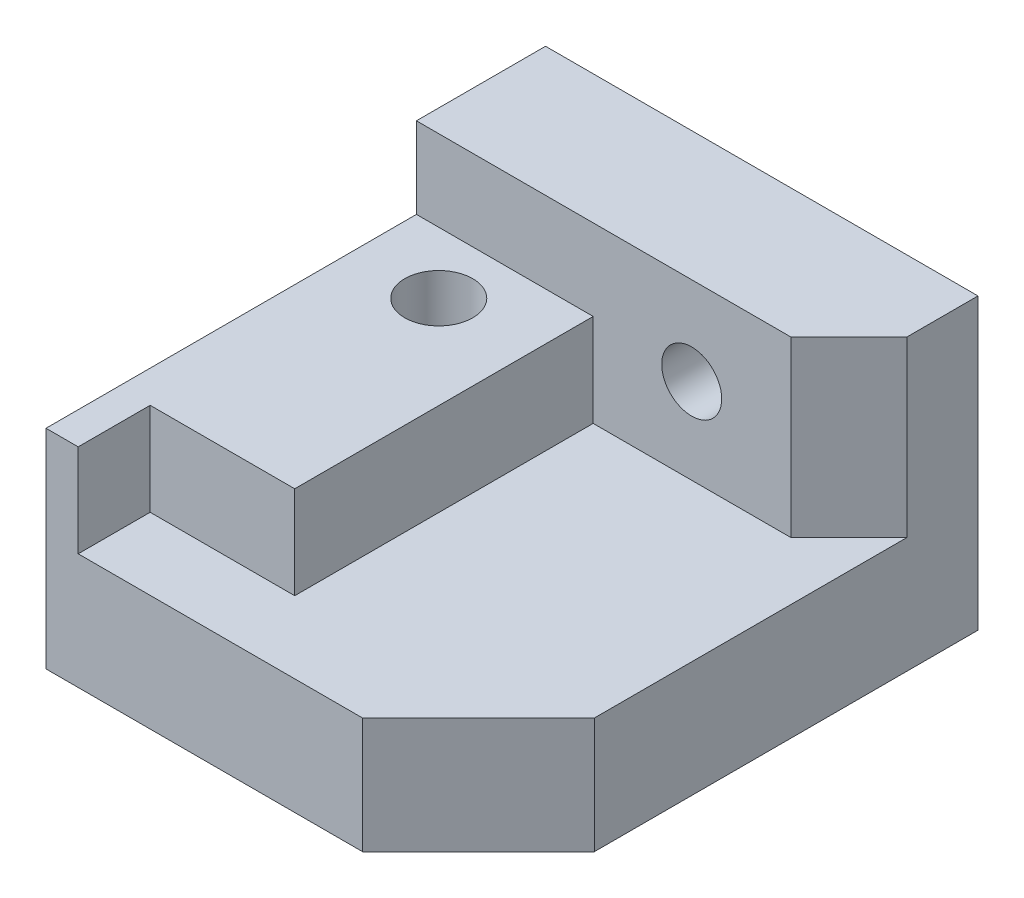
ISO-10303-21;
HEADER;
FILE_DESCRIPTION(('STEP AP214'),'2;1');
FILE_NAME('part.step','',(''),(''),'','','');
FILE_SCHEMA(('AUTOMOTIVE_DESIGN { 1 0 10303 214 1 1 1 1 }'));
ENDSEC;
DATA;
#1=APPLICATION_CONTEXT('core data for automotive mechanical design processes');
#2=APPLICATION_PROTOCOL_DEFINITION('international standard','automotive_design',2000,#1);
#3=PRODUCT_CONTEXT('',#1,'mechanical');
#4=PRODUCT('Part','Part','',(#3));
#5=PRODUCT_RELATED_PRODUCT_CATEGORY('part','',(#4));
#6=PRODUCT_DEFINITION_FORMATION('','',#4);
#7=PRODUCT_DEFINITION_CONTEXT('part definition',#1,'design');
#8=PRODUCT_DEFINITION('design','',#6,#7);
#9=PRODUCT_DEFINITION_SHAPE('','',#8);
#10=(LENGTH_UNIT() NAMED_UNIT(*) SI_UNIT(.MILLI.,.METRE.));
#11=(NAMED_UNIT(*) PLANE_ANGLE_UNIT() SI_UNIT($,.RADIAN.));
#12=(NAMED_UNIT(*) SI_UNIT($,.STERADIAN.) SOLID_ANGLE_UNIT());
#13=UNCERTAINTY_MEASURE_WITH_UNIT(LENGTH_MEASURE(1.E-05),#10,'distance_accuracy_value','');
#14=(GEOMETRIC_REPRESENTATION_CONTEXT(3) GLOBAL_UNCERTAINTY_ASSIGNED_CONTEXT((#13)) GLOBAL_UNIT_ASSIGNED_CONTEXT((#10,
#11,#12)) REPRESENTATION_CONTEXT('',''));
#15=CARTESIAN_POINT('',(0.,0.,0.));
#16=DIRECTION('',(0.,0.,1.));
#17=DIRECTION('',(1.,0.,0.));
#18=AXIS2_PLACEMENT_3D('',#15,#16,#17);
#19=CARTESIAN_POINT('',(0.,10.,0.));
#20=DIRECTION('',(0.,1.,0.));
#21=DIRECTION('',(0.,0.,1.));
#22=AXIS2_PLACEMENT_3D('',#19,#20,#21);
#23=PLANE('',#22);
#24=DIRECTION('',(-0.707106781186548,0.,0.707106781186548));
#25=VECTOR('',#24,1.);
#26=CARTESIAN_POINT('',(0.178897186023816,10.,0.178897186023816));
#27=LINE('',#26,#25);
#28=CARTESIAN_POINT('',(37.3462177965765,10.,-36.9884234245288));
#29=VERTEX_POINT('',#28);
#30=CARTESIAN_POINT('',(32.3462177965765,10.,-31.9884234245289));
#31=VERTEX_POINT('',#30);
#32=EDGE_CURVE('E102',#29,#31,#27,.T.);
#33=ORIENTED_EDGE('',*,*,#32,.T.);
#34=DIRECTION('',(-1.,0.,0.));
#35=VECTOR('',#34,1.);
#36=CARTESIAN_POINT('',(0.,10.,-31.9884234245289));
#37=LINE('',#36,#35);
#38=CARTESIAN_POINT('',(15.2645951036508,10.,-31.9884234245289));
#39=VERTEX_POINT('',#38);
#40=EDGE_CURVE('E190',#31,#39,#37,.T.);
#41=ORIENTED_EDGE('',*,*,#40,.T.);
#42=DIRECTION('',(0.,0.,1.));
#43=VECTOR('',#42,1.);
#44=CARTESIAN_POINT('',(15.2645951036508,10.,-32.0144950211485));
#45=LINE('',#44,#43);
#46=CARTESIAN_POINT('',(15.2645951036508,10.,-6.21379025277576));
#47=VERTEX_POINT('',#46);
#48=EDGE_CURVE('E185',#39,#47,#45,.T.);
#49=ORIENTED_EDGE('',*,*,#48,.T.);
#50=DIRECTION('',(-1.,0.,0.));
#51=VECTOR('',#50,1.);
#52=CARTESIAN_POINT('',(15.2645951036508,10.,-6.21379025277576));
#53=LINE('',#52,#51);
#54=CARTESIAN_POINT('',(2.78057267490278,10.,-6.21379025277576));
#55=VERTEX_POINT('',#54);
#56=EDGE_CURVE('E169',#47,#55,#53,.T.);
#57=ORIENTED_EDGE('',*,*,#56,.T.);
#58=DIRECTION('',(0.,0.,1.));
#59=VECTOR('',#58,1.);
#60=CARTESIAN_POINT('',(2.78057267490278,10.,0.));
#61=LINE('',#60,#59);
#62=CARTESIAN_POINT('',(2.78057267490278,10.,0.));
#63=VERTEX_POINT('',#62);
#64=EDGE_CURVE('E179',#55,#63,#61,.T.);
#65=ORIENTED_EDGE('',*,*,#64,.T.);
#66=DIRECTION('',(1.,0.,0.));
#67=VECTOR('',#66,1.);
#68=CARTESIAN_POINT('',(0.,10.,0.));
#69=LINE('',#68,#67);
#70=CARTESIAN_POINT('',(27.3462177965765,10.,0.));
#71=VERTEX_POINT('',#70);
#72=EDGE_CURVE('E94',#63,#71,#69,.T.);
#73=ORIENTED_EDGE('',*,*,#72,.T.);
#74=DIRECTION('',(0.707106781186548,0.,-0.707106781186547));
#75=VECTOR('',#74,1.);
#76=CARTESIAN_POINT('',(27.3462177965765,10.,0.));
#77=LINE('',#76,#75);
#78=CARTESIAN_POINT('',(37.3462177965765,10.,-10.));
#79=VERTEX_POINT('',#78);
#80=EDGE_CURVE('E211',#71,#79,#77,.T.);
#81=ORIENTED_EDGE('',*,*,#80,.T.);
#82=DIRECTION('',(0.,0.,-1.));
#83=VECTOR('',#82,1.);
#84=CARTESIAN_POINT('',(37.3462177965765,10.,-10.));
#85=LINE('',#84,#83);
#86=EDGE_CURVE('E215',#79,#29,#85,.T.);
#87=ORIENTED_EDGE('',*,*,#86,.T.);
#88=EDGE_LOOP('',(#33,#41,#49,#57,#65,#73,#81,#87));
#89=FACE_BOUND('',#88,.T.);
#90=ADVANCED_FACE('F76',(#89),#23,.T.);
#91=CARTESIAN_POINT('',(0.,18.,0.));
#92=DIRECTION('',(0.,1.,0.));
#93=DIRECTION('',(0.,0.,1.));
#94=AXIS2_PLACEMENT_3D('',#91,#92,#93);
#95=PLANE('',#94);
#96=CARTESIAN_POINT('',(7.23477267971787,18.,-26.6815035731092));
#97=DIRECTION('',(0.,1.,0.));
#98=DIRECTION('',(0.,0.,1.));
#99=AXIS2_PLACEMENT_3D('',#96,#97,#98);
#100=CIRCLE('',#99,2.93404528514396);
#101=CARTESIAN_POINT('',(7.23477267971787,18.,-23.7474582879652));
#102=VERTEX_POINT('',#101);
#103=EDGE_CURVE('E483',#102,#102,#100,.T.);
#104=ORIENTED_EDGE('',*,*,#103,.F.);
#105=EDGE_LOOP('',(#104));
#106=FACE_BOUND('',#105,.T.);
#107=DIRECTION('',(0.,0.,1.));
#108=VECTOR('',#107,1.);
#109=CARTESIAN_POINT('',(2.78057267490278,18.,0.));
#110=LINE('',#109,#108);
#111=CARTESIAN_POINT('',(2.78057267490278,18.,-6.21379025277576));
#112=VERTEX_POINT('',#111);
#113=CARTESIAN_POINT('',(2.78057267490278,18.,0.));
#114=VERTEX_POINT('',#113);
#115=EDGE_CURVE('E180',#112,#114,#110,.T.);
#116=ORIENTED_EDGE('',*,*,#115,.F.);
#117=DIRECTION('',(-1.,0.,0.));
#118=VECTOR('',#117,1.);
#119=CARTESIAN_POINT('',(15.2645951036508,18.,-6.21379025277576));
#120=LINE('',#119,#118);
#121=CARTESIAN_POINT('',(15.2645951036508,18.,-6.21379025277576));
#122=VERTEX_POINT('',#121);
#123=EDGE_CURVE('E490',#122,#112,#120,.T.);
#124=ORIENTED_EDGE('',*,*,#123,.F.);
#125=DIRECTION('',(0.,0.,1.));
#126=VECTOR('',#125,1.);
#127=CARTESIAN_POINT('',(15.2645951036508,18.,-32.0144950211485));
#128=LINE('',#127,#126);
#129=CARTESIAN_POINT('',(15.2645951036508,18.,-31.9884234245289));
#130=VERTEX_POINT('',#129);
#131=EDGE_CURVE('E187',#130,#122,#128,.T.);
#132=ORIENTED_EDGE('',*,*,#131,.F.);
#133=DIRECTION('',(-1.,0.,0.));
#134=VECTOR('',#133,1.);
#135=CARTESIAN_POINT('',(0.,18.,-31.9884234245289));
#136=LINE('',#135,#134);
#137=CARTESIAN_POINT('',(0.,18.,-31.9884234245289));
#138=VERTEX_POINT('',#137);
#139=EDGE_CURVE('E532',#130,#138,#136,.T.);
#140=ORIENTED_EDGE('',*,*,#139,.T.);
#141=DIRECTION('',(0.,0.,1.));
#142=VECTOR('',#141,1.);
#143=CARTESIAN_POINT('',(0.,18.,-32.0144950211485));
#144=LINE('',#143,#142);
#145=CARTESIAN_POINT('',(0.,18.,0.));
#146=VERTEX_POINT('',#145);
#147=EDGE_CURVE('E80',#138,#146,#144,.T.);
#148=ORIENTED_EDGE('',*,*,#147,.T.);
#149=DIRECTION('',(1.,0.,0.));
#150=VECTOR('',#149,1.);
#151=CARTESIAN_POINT('',(0.,18.,0.));
#152=LINE('',#151,#150);
#153=EDGE_CURVE('E192',#146,#114,#152,.T.);
#154=ORIENTED_EDGE('',*,*,#153,.T.);
#155=EDGE_LOOP('',(#116,#124,#132,#140,#148,#154));
#156=FACE_BOUND('',#155,.T.);
#157=ADVANCED_FACE('F291',(#106,#156),#95,.T.);
#158=CARTESIAN_POINT('',(15.2645951036508,10.,-32.0144950211485));
#159=DIRECTION('',(-1.,0.,0.));
#160=DIRECTION('',(0.,0.,1.));
#161=AXIS2_PLACEMENT_3D('',#158,#159,#160);
#162=PLANE('',#161);
#163=ORIENTED_EDGE('',*,*,#131,.T.);
#164=DIRECTION('',(0.,1.,0.));
#165=VECTOR('',#164,1.);
#166=CARTESIAN_POINT('',(15.2645951036508,10.,-6.21379025277576));
#167=LINE('',#166,#165);
#168=EDGE_CURVE('E173',#47,#122,#167,.T.);
#169=ORIENTED_EDGE('',*,*,#168,.F.);
#170=ORIENTED_EDGE('',*,*,#48,.F.);
#171=DIRECTION('',(0.,-1.,0.));
#172=VECTOR('',#171,1.);
#173=CARTESIAN_POINT('',(15.2645951036508,10.,-31.9884234245289));
#174=LINE('',#173,#172);
#175=EDGE_CURVE('E12',#130,#39,#174,.T.);
#176=ORIENTED_EDGE('',*,*,#175,.F.);
#177=EDGE_LOOP('',(#163,#169,#170,#176));
#178=FACE_BOUND('',#177,.T.);
#179=ADVANCED_FACE('F184',(#178),#162,.F.);
#180=CARTESIAN_POINT('',(27.3462177965765,10.,0.));
#181=DIRECTION('',(-0.707106781186547,0.,-0.707106781186548));
#182=DIRECTION('',(-0.707106781186548,0.,0.707106781186547));
#183=AXIS2_PLACEMENT_3D('',#180,#181,#182);
#184=PLANE('',#183);
#185=DIRECTION('',(0.707106781186548,0.,-0.707106781186547));
#186=VECTOR('',#185,1.);
#187=CARTESIAN_POINT('',(27.3462177965765,0.,0.));
#188=LINE('',#187,#186);
#189=CARTESIAN_POINT('',(27.3462177965765,0.,0.));
#190=VERTEX_POINT('',#189);
#191=CARTESIAN_POINT('',(37.3462177965765,0.,-10.));
#192=VERTEX_POINT('',#191);
#193=EDGE_CURVE('E197',#190,#192,#188,.T.);
#194=ORIENTED_EDGE('',*,*,#193,.T.);
#195=DIRECTION('',(0.,-1.,0.));
#196=VECTOR('',#195,1.);
#197=CARTESIAN_POINT('',(37.3462177965765,10.,-10.));
#198=LINE('',#197,#196);
#199=EDGE_CURVE('E87',#79,#192,#198,.T.);
#200=ORIENTED_EDGE('',*,*,#199,.F.);
#201=ORIENTED_EDGE('',*,*,#80,.F.);
#202=DIRECTION('',(0.,-1.,0.));
#203=VECTOR('',#202,1.);
#204=CARTESIAN_POINT('',(27.3462177965765,10.,0.));
#205=LINE('',#204,#203);
#206=EDGE_CURVE('E226',#71,#190,#205,.T.);
#207=ORIENTED_EDGE('',*,*,#206,.T.);
#208=EDGE_LOOP('',(#194,#200,#201,#207));
#209=FACE_BOUND('',#208,.T.);
#210=ADVANCED_FACE('F78',(#209),#184,.F.);
#211=CARTESIAN_POINT('',(37.3462177965765,10.,-10.));
#212=DIRECTION('',(-1.,0.,0.));
#213=DIRECTION('',(0.,0.,1.));
#214=AXIS2_PLACEMENT_3D('',#211,#212,#213);
#215=PLANE('',#214);
#216=DIRECTION('',(0.,-1.,0.));
#217=VECTOR('',#216,1.);
#218=CARTESIAN_POINT('',(37.3462177965765,10.,-43.1388364195815));
#219=LINE('',#218,#217);
#220=CARTESIAN_POINT('',(37.3462177965765,25.,-43.1388364195815));
#221=VERTEX_POINT('',#220);
#222=CARTESIAN_POINT('',(37.3462177965765,0.,-43.1388364195815));
#223=VERTEX_POINT('',#222);
#224=EDGE_CURVE('E238',#221,#223,#219,.T.);
#225=ORIENTED_EDGE('',*,*,#224,.F.);
#226=DIRECTION('',(0.,0.,1.));
#227=VECTOR('',#226,1.);
#228=CARTESIAN_POINT('',(37.3462177965765,25.,-43.1388364195815));
#229=LINE('',#228,#227);
#230=CARTESIAN_POINT('',(37.3462177965765,25.,-36.9884234245288));
#231=VERTEX_POINT('',#230);
#232=EDGE_CURVE('E512',#221,#231,#229,.T.);
#233=ORIENTED_EDGE('',*,*,#232,.T.);
#234=DIRECTION('',(0.,-1.,0.));
#235=VECTOR('',#234,1.);
#236=CARTESIAN_POINT('',(37.3462177965765,25.,-36.9884234245288));
#237=LINE('',#236,#235);
#238=EDGE_CURVE('E525',#231,#29,#237,.T.);
#239=ORIENTED_EDGE('',*,*,#238,.T.);
#240=ORIENTED_EDGE('',*,*,#86,.F.);
#241=ORIENTED_EDGE('',*,*,#199,.T.);
#242=DIRECTION('',(0.,0.,-1.));
#243=VECTOR('',#242,1.);
#244=CARTESIAN_POINT('',(37.3462177965765,0.,-10.));
#245=LINE('',#244,#243);
#246=EDGE_CURVE('E259',#192,#223,#245,.T.);
#247=ORIENTED_EDGE('',*,*,#246,.T.);
#248=EDGE_LOOP('',(#225,#233,#239,#240,#241,#247));
#249=FACE_BOUND('',#248,.T.);
#250=ADVANCED_FACE('F258',(#249),#215,.F.);
#251=CARTESIAN_POINT('',(0.,10.,-43.1388364195815));
#252=DIRECTION('',(0.,0.,-1.));
#253=DIRECTION('',(-1.,0.,0.));
#254=AXIS2_PLACEMENT_3D('',#251,#252,#253);
#255=PLANE('',#254);
#256=CARTESIAN_POINT('',(23.7733258062192,17.3847516461843,-43.1388364195815));
#257=DIRECTION('',(0.,0.,-1.));
#258=DIRECTION('',(-1.,0.,0.));
#259=AXIS2_PLACEMENT_3D('',#256,#257,#258);
#260=CIRCLE('',#259,2.59003935259056);
#261=CARTESIAN_POINT('',(21.1832864536287,17.3847516461843,-43.1388364195815));
#262=VERTEX_POINT('',#261);
#263=EDGE_CURVE('E476',#262,#262,#260,.T.);
#264=ORIENTED_EDGE('',*,*,#263,.F.);
#265=EDGE_LOOP('',(#264));
#266=FACE_BOUND('',#265,.T.);
#267=DIRECTION('',(1.,0.,0.));
#268=VECTOR('',#267,1.);
#269=CARTESIAN_POINT('',(0.,0.,-43.1388364195815));
#270=LINE('',#269,#268);
#271=CARTESIAN_POINT('',(0.,0.,-43.1388364195815));
#272=VERTEX_POINT('',#271);
#273=EDGE_CURVE('E264',#272,#223,#270,.T.);
#274=ORIENTED_EDGE('',*,*,#273,.F.);
#275=DIRECTION('',(0.,-1.,0.));
#276=VECTOR('',#275,1.);
#277=CARTESIAN_POINT('',(0.,10.,-43.1388364195815));
#278=LINE('',#277,#276);
#279=CARTESIAN_POINT('',(0.,25.,-43.1388364195815));
#280=VERTEX_POINT('',#279);
#281=EDGE_CURVE('E230',#280,#272,#278,.T.);
#282=ORIENTED_EDGE('',*,*,#281,.F.);
#283=DIRECTION('',(1.,0.,0.));
#284=VECTOR('',#283,1.);
#285=CARTESIAN_POINT('',(0.,25.,-43.1388364195815));
#286=LINE('',#285,#284);
#287=EDGE_CURVE('E516',#280,#221,#286,.T.);
#288=ORIENTED_EDGE('',*,*,#287,.T.);
#289=ORIENTED_EDGE('',*,*,#224,.T.);
#290=EDGE_LOOP('',(#274,#282,#288,#289));
#291=FACE_BOUND('',#290,.T.);
#292=ADVANCED_FACE('F280',(#266,#291),#255,.T.);
#293=CARTESIAN_POINT('',(0.,10.,0.));
#294=DIRECTION('',(-1.,0.,0.));
#295=DIRECTION('',(0.,0.,1.));
#296=AXIS2_PLACEMENT_3D('',#293,#294,#295);
#297=PLANE('',#296);
#298=DIRECTION('',(0.,0.,1.));
#299=VECTOR('',#298,1.);
#300=CARTESIAN_POINT('',(0.,25.,-43.1388364195815));
#301=LINE('',#300,#299);
#302=CARTESIAN_POINT('',(0.,25.,-31.9884234245289));
#303=VERTEX_POINT('',#302);
#304=EDGE_CURVE('E278',#280,#303,#301,.T.);
#305=ORIENTED_EDGE('',*,*,#304,.F.);
#306=ORIENTED_EDGE('',*,*,#281,.T.);
#307=DIRECTION('',(0.,0.,-1.));
#308=VECTOR('',#307,1.);
#309=CARTESIAN_POINT('',(0.,0.,0.));
#310=LINE('',#309,#308);
#311=CARTESIAN_POINT('',(0.,0.,0.));
#312=VERTEX_POINT('',#311);
#313=EDGE_CURVE('E266',#312,#272,#310,.T.);
#314=ORIENTED_EDGE('',*,*,#313,.F.);
#315=DIRECTION('',(0.,-1.,0.));
#316=VECTOR('',#315,1.);
#317=CARTESIAN_POINT('',(0.,10.,0.));
#318=LINE('',#317,#316);
#319=EDGE_CURVE('E228',#146,#312,#318,.T.);
#320=ORIENTED_EDGE('',*,*,#319,.F.);
#321=ORIENTED_EDGE('',*,*,#147,.F.);
#322=DIRECTION('',(0.,-1.,0.));
#323=VECTOR('',#322,1.);
#324=CARTESIAN_POINT('',(0.,25.,-31.9884234245289));
#325=LINE('',#324,#323);
#326=EDGE_CURVE('E521',#303,#138,#325,.T.);
#327=ORIENTED_EDGE('',*,*,#326,.F.);
#328=EDGE_LOOP('',(#305,#306,#314,#320,#321,#327));
#329=FACE_BOUND('',#328,.T.);
#330=ADVANCED_FACE('F275',(#329),#297,.T.);
#331=CARTESIAN_POINT('',(0.,10.,0.));
#332=DIRECTION('',(0.,0.,-1.));
#333=DIRECTION('',(-1.,0.,0.));
#334=AXIS2_PLACEMENT_3D('',#331,#332,#333);
#335=PLANE('',#334);
#336=ORIENTED_EDGE('',*,*,#72,.F.);
#337=DIRECTION('',(0.,1.,0.));
#338=VECTOR('',#337,1.);
#339=CARTESIAN_POINT('',(2.78057267490278,10.,0.));
#340=LINE('',#339,#338);
#341=EDGE_CURVE('E500',#63,#114,#340,.T.);
#342=ORIENTED_EDGE('',*,*,#341,.T.);
#343=ORIENTED_EDGE('',*,*,#153,.F.);
#344=ORIENTED_EDGE('',*,*,#319,.T.);
#345=DIRECTION('',(1.,0.,0.));
#346=VECTOR('',#345,1.);
#347=CARTESIAN_POINT('',(0.,0.,0.));
#348=LINE('',#347,#346);
#349=EDGE_CURVE('E216',#312,#190,#348,.T.);
#350=ORIENTED_EDGE('',*,*,#349,.T.);
#351=ORIENTED_EDGE('',*,*,#206,.F.);
#352=EDGE_LOOP('',(#336,#342,#343,#344,#350,#351));
#353=FACE_BOUND('',#352,.T.);
#354=ADVANCED_FACE('F271',(#353),#335,.F.);
#355=CARTESIAN_POINT('',(0.,0.,0.));
#356=DIRECTION('',(0.,1.,0.));
#357=DIRECTION('',(0.,0.,1.));
#358=AXIS2_PLACEMENT_3D('',#355,#356,#357);
#359=PLANE('',#358);
#360=CARTESIAN_POINT('',(7.23477267971787,0.,-26.6815035731092));
#361=DIRECTION('',(0.,1.,0.));
#362=DIRECTION('',(0.,0.,1.));
#363=AXIS2_PLACEMENT_3D('',#360,#361,#362);
#364=CIRCLE('',#363,2.93404528514396);
#365=CARTESIAN_POINT('',(7.23477267971787,0.,-23.7474582879652));
#366=VERTEX_POINT('',#365);
#367=EDGE_CURVE('E486',#366,#366,#364,.T.);
#368=ORIENTED_EDGE('',*,*,#367,.T.);
#369=EDGE_LOOP('',(#368));
#370=FACE_BOUND('',#369,.T.);
#371=ORIENTED_EDGE('',*,*,#313,.T.);
#372=ORIENTED_EDGE('',*,*,#273,.T.);
#373=ORIENTED_EDGE('',*,*,#246,.F.);
#374=ORIENTED_EDGE('',*,*,#193,.F.);
#375=ORIENTED_EDGE('',*,*,#349,.F.);
#376=EDGE_LOOP('',(#371,#372,#373,#374,#375));
#377=FACE_BOUND('',#376,.T.);
#378=ADVANCED_FACE('F272',(#370,#377),#359,.F.);
#379=CARTESIAN_POINT('',(0.,25.,-31.9884234245289));
#380=DIRECTION('',(0.,0.,-1.));
#381=DIRECTION('',(-1.,0.,0.));
#382=AXIS2_PLACEMENT_3D('',#379,#380,#381);
#383=PLANE('',#382);
#384=CARTESIAN_POINT('',(23.7733258062192,17.3847516461843,-31.9884234245289));
#385=DIRECTION('',(0.,0.,1.));
#386=DIRECTION('',(1.,0.,0.));
#387=AXIS2_PLACEMENT_3D('',#384,#385,#386);
#388=CIRCLE('',#387,2.59003935259056);
#389=CARTESIAN_POINT('',(26.3633651588098,17.3847516461843,-31.9884234245289));
#390=VERTEX_POINT('',#389);
#391=EDGE_CURVE('E479',#390,#390,#388,.T.);
#392=ORIENTED_EDGE('',*,*,#391,.F.);
#393=EDGE_LOOP('',(#392));
#394=FACE_BOUND('',#393,.T.);
#395=ORIENTED_EDGE('',*,*,#40,.F.);
#396=DIRECTION('',(0.,-1.,0.));
#397=VECTOR('',#396,1.);
#398=CARTESIAN_POINT('',(32.3462177965765,25.,-31.9884234245289));
#399=LINE('',#398,#397);
#400=CARTESIAN_POINT('',(32.3462177965765,25.,-31.9884234245289));
#401=VERTEX_POINT('',#400);
#402=EDGE_CURVE('E528',#401,#31,#399,.T.);
#403=ORIENTED_EDGE('',*,*,#402,.F.);
#404=DIRECTION('',(1.,0.,0.));
#405=VECTOR('',#404,1.);
#406=CARTESIAN_POINT('',(0.,25.,-31.9884234245289));
#407=LINE('',#406,#405);
#408=EDGE_CURVE('E503',#303,#401,#407,.T.);
#409=ORIENTED_EDGE('',*,*,#408,.F.);
#410=ORIENTED_EDGE('',*,*,#326,.T.);
#411=ORIENTED_EDGE('',*,*,#139,.F.);
#412=ORIENTED_EDGE('',*,*,#175,.T.);
#413=EDGE_LOOP('',(#395,#403,#409,#410,#411,#412));
#414=FACE_BOUND('',#413,.T.);
#415=ADVANCED_FACE('F302',(#394,#414),#383,.F.);
#416=CARTESIAN_POINT('',(32.3462177965765,25.,-31.9884234245289));
#417=DIRECTION('',(-0.707106781186547,0.,-0.707106781186547));
#418=DIRECTION('',(-0.707106781186548,0.,0.707106781186548));
#419=AXIS2_PLACEMENT_3D('',#416,#417,#418);
#420=PLANE('',#419);
#421=ORIENTED_EDGE('',*,*,#32,.F.);
#422=ORIENTED_EDGE('',*,*,#238,.F.);
#423=DIRECTION('',(0.707106781186547,0.,-0.707106781186547));
#424=VECTOR('',#423,1.);
#425=CARTESIAN_POINT('',(32.3462177965765,25.,-31.9884234245289));
#426=LINE('',#425,#424);
#427=EDGE_CURVE('E509',#401,#231,#426,.T.);
#428=ORIENTED_EDGE('',*,*,#427,.F.);
#429=ORIENTED_EDGE('',*,*,#402,.T.);
#430=EDGE_LOOP('',(#421,#422,#428,#429));
#431=FACE_BOUND('',#430,.T.);
#432=ADVANCED_FACE('F323',(#431),#420,.F.);
#433=CARTESIAN_POINT('',(0.,25.,0.));
#434=DIRECTION('',(0.,-1.,0.));
#435=DIRECTION('',(0.,0.,-1.));
#436=AXIS2_PLACEMENT_3D('',#433,#434,#435);
#437=PLANE('',#436);
#438=ORIENTED_EDGE('',*,*,#408,.T.);
#439=ORIENTED_EDGE('',*,*,#427,.T.);
#440=ORIENTED_EDGE('',*,*,#232,.F.);
#441=ORIENTED_EDGE('',*,*,#287,.F.);
#442=ORIENTED_EDGE('',*,*,#304,.T.);
#443=EDGE_LOOP('',(#438,#439,#440,#441,#442));
#444=FACE_BOUND('',#443,.T.);
#445=ADVANCED_FACE('F332',(#444),#437,.F.);
#446=CARTESIAN_POINT('',(2.78057267490278,10.,0.));
#447=DIRECTION('',(-1.,0.,0.));
#448=DIRECTION('',(0.,0.,1.));
#449=AXIS2_PLACEMENT_3D('',#446,#447,#448);
#450=PLANE('',#449);
#451=ORIENTED_EDGE('',*,*,#115,.T.);
#452=ORIENTED_EDGE('',*,*,#341,.F.);
#453=ORIENTED_EDGE('',*,*,#64,.F.);
#454=DIRECTION('',(0.,1.,0.));
#455=VECTOR('',#454,1.);
#456=CARTESIAN_POINT('',(2.78057267490278,10.,-6.21379025277576));
#457=LINE('',#456,#455);
#458=EDGE_CURVE('E175',#55,#112,#457,.T.);
#459=ORIENTED_EDGE('',*,*,#458,.T.);
#460=EDGE_LOOP('',(#451,#452,#453,#459));
#461=FACE_BOUND('',#460,.T.);
#462=ADVANCED_FACE('F340',(#461),#450,.F.);
#463=CARTESIAN_POINT('',(15.2645951036508,10.,-6.21379025277576));
#464=DIRECTION('',(0.,0.,-1.));
#465=DIRECTION('',(-1.,0.,0.));
#466=AXIS2_PLACEMENT_3D('',#463,#464,#465);
#467=PLANE('',#466);
#468=ORIENTED_EDGE('',*,*,#123,.T.);
#469=ORIENTED_EDGE('',*,*,#458,.F.);
#470=ORIENTED_EDGE('',*,*,#56,.F.);
#471=ORIENTED_EDGE('',*,*,#168,.T.);
#472=EDGE_LOOP('',(#468,#469,#470,#471));
#473=FACE_BOUND('',#472,.T.);
#474=ADVANCED_FACE('F172',(#473),#467,.F.);
#475=CARTESIAN_POINT('',(7.23477267971787,0.,-26.6815035731092));
#476=DIRECTION('',(0.,1.,0.));
#477=DIRECTION('',(0.,0.,1.));
#478=AXIS2_PLACEMENT_3D('',#475,#476,#477);
#479=CYLINDRICAL_SURFACE('',#478,2.93404528514396);
#480=ORIENTED_EDGE('',*,*,#367,.F.);
#481=EDGE_LOOP('',(#480));
#482=FACE_BOUND('',#481,.T.);
#483=ORIENTED_EDGE('',*,*,#103,.T.);
#484=EDGE_LOOP('',(#483));
#485=FACE_BOUND('',#484,.T.);
#486=ADVANCED_FACE('F354',(#482,#485),#479,.F.);
#487=CARTESIAN_POINT('',(23.7733258062192,17.3847516461843,-49.9884234245289));
#488=DIRECTION('',(0.,0.,1.));
#489=DIRECTION('',(1.,0.,0.));
#490=AXIS2_PLACEMENT_3D('',#487,#488,#489);
#491=CYLINDRICAL_SURFACE('',#490,2.59003935259056);
#492=ORIENTED_EDGE('',*,*,#263,.T.);
#493=EDGE_LOOP('',(#492));
#494=FACE_BOUND('',#493,.T.);
#495=ORIENTED_EDGE('',*,*,#391,.T.);
#496=EDGE_LOOP('',(#495));
#497=FACE_BOUND('',#496,.T.);
#498=ADVANCED_FACE('F360',(#494,#497),#491,.F.);
#499=CLOSED_SHELL('',(#90,#157,#179,#210,#250,#292,#330,#354,#378,#415,#432,#445,#462,#474,#486,#498));
#500=MANIFOLD_SOLID_BREP('B2',#499);
#501=ADVANCED_BREP_SHAPE_REPRESENTATION('',(#18,#500),#14);
#502=SHAPE_DEFINITION_REPRESENTATION(#9,#501);
ENDSEC;
END-ISO-10303-21;
